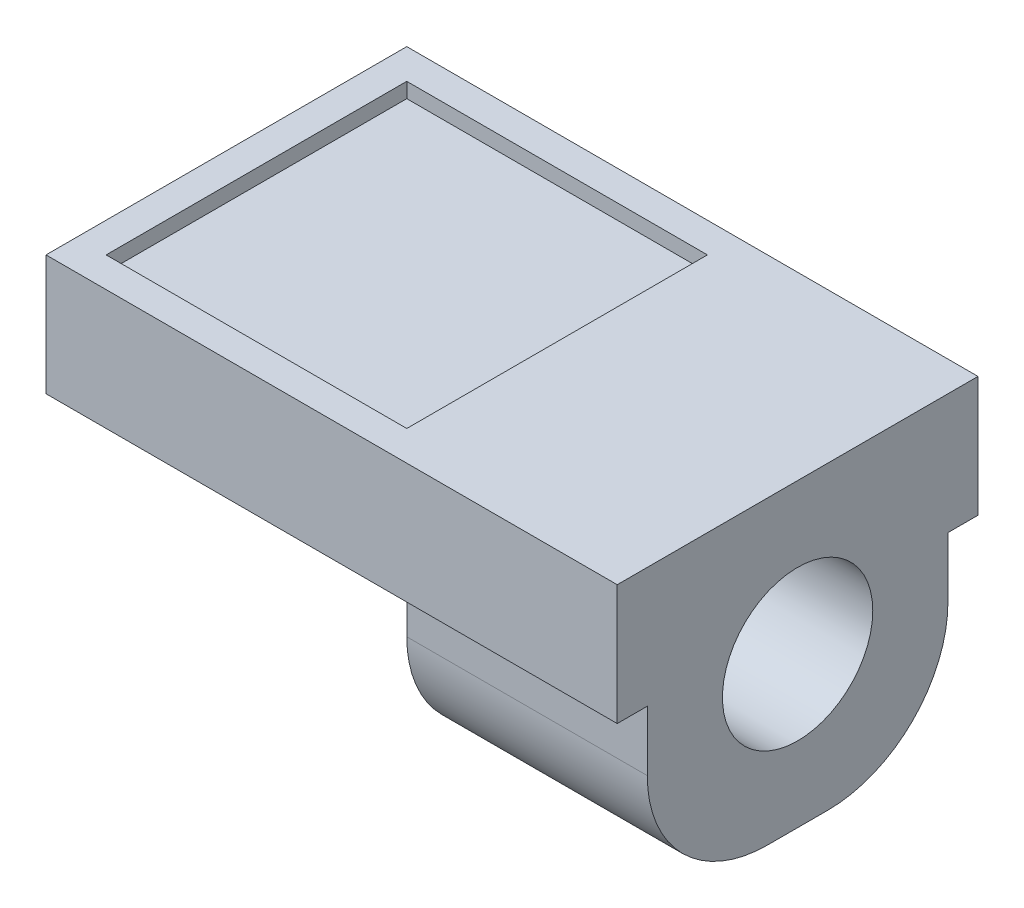
ISO-10303-21;
HEADER;
FILE_DESCRIPTION(('STEP AP214'),'2;1');
FILE_NAME('part.step','',(''),(''),'','','');
FILE_SCHEMA(('AUTOMOTIVE_DESIGN { 1 0 10303 214 1 1 1 1 }'));
ENDSEC;
DATA;
#1=APPLICATION_CONTEXT('core data for automotive mechanical design processes');
#2=APPLICATION_PROTOCOL_DEFINITION('international standard','automotive_design',2000,#1);
#3=PRODUCT_CONTEXT('',#1,'mechanical');
#4=PRODUCT('Part','Part','',(#3));
#5=PRODUCT_RELATED_PRODUCT_CATEGORY('part','',(#4));
#6=PRODUCT_DEFINITION_FORMATION('','',#4);
#7=PRODUCT_DEFINITION_CONTEXT('part definition',#1,'design');
#8=PRODUCT_DEFINITION('design','',#6,#7);
#9=PRODUCT_DEFINITION_SHAPE('','',#8);
#10=(LENGTH_UNIT() NAMED_UNIT(*) SI_UNIT(.MILLI.,.METRE.));
#11=(NAMED_UNIT(*) PLANE_ANGLE_UNIT() SI_UNIT($,.RADIAN.));
#12=(NAMED_UNIT(*) SI_UNIT($,.STERADIAN.) SOLID_ANGLE_UNIT());
#13=UNCERTAINTY_MEASURE_WITH_UNIT(LENGTH_MEASURE(1.E-05),#10,'distance_accuracy_value','');
#14=(GEOMETRIC_REPRESENTATION_CONTEXT(3) GLOBAL_UNCERTAINTY_ASSIGNED_CONTEXT((#13)) GLOBAL_UNIT_ASSIGNED_CONTEXT((#10,
#11,#12)) REPRESENTATION_CONTEXT('',''));
#15=CARTESIAN_POINT('',(0.,0.,0.));
#16=DIRECTION('',(0.,0.,1.));
#17=DIRECTION('',(1.,0.,0.));
#18=AXIS2_PLACEMENT_3D('',#15,#16,#17);
#19=CARTESIAN_POINT('',(0.,0.,0.));
#20=DIRECTION('',(0.,-1.,0.));
#21=DIRECTION('',(0.,0.,-1.));
#22=AXIS2_PLACEMENT_3D('',#19,#20,#21);
#23=PLANE('',#22);
#24=DIRECTION('',(0.,0.,-1.));
#25=VECTOR('',#24,1.);
#26=CARTESIAN_POINT('',(4.,0.,5.));
#27=LINE('',#26,#25);
#28=CARTESIAN_POINT('',(4.,0.,1.));
#29=VERTEX_POINT('',#28);
#30=CARTESIAN_POINT('',(4.,0.,-1.));
#31=VERTEX_POINT('',#30);
#32=EDGE_CURVE('E310',#29,#31,#27,.T.);
#33=ORIENTED_EDGE('',*,*,#32,.F.);
#34=DIRECTION('',(1.,0.,0.));
#35=VECTOR('',#34,1.);
#36=CARTESIAN_POINT('',(-4.,0.,1.));
#37=LINE('',#36,#35);
#38=CARTESIAN_POINT('',(0.,0.,1.));
#39=VERTEX_POINT('',#38);
#40=EDGE_CURVE('E271',#29,#39,#37,.F.);
#41=ORIENTED_EDGE('',*,*,#40,.T.);
#42=CARTESIAN_POINT('',(0.,0.,0.));
#43=DIRECTION('',(0.,-1.,0.));
#44=DIRECTION('',(0.,0.,-1.));
#45=AXIS2_PLACEMENT_3D('',#42,#43,#44);
#46=CIRCLE('',#45,1.);
#47=CARTESIAN_POINT('',(0.,0.,-1.));
#48=VERTEX_POINT('',#47);
#49=EDGE_CURVE('E205',#48,#39,#46,.T.);
#50=ORIENTED_EDGE('',*,*,#49,.F.);
#51=DIRECTION('',(-1.,0.,0.));
#52=VECTOR('',#51,1.);
#53=CARTESIAN_POINT('',(4.,0.,-1.));
#54=LINE('',#53,#52);
#55=EDGE_CURVE('E275',#48,#31,#54,.F.);
#56=ORIENTED_EDGE('',*,*,#55,.T.);
#57=EDGE_LOOP('',(#33,#41,#50,#56));
#58=FACE_BOUND('',#57,.T.);
#59=ADVANCED_FACE('F33',(#58),#23,.T.);
#60=CARTESIAN_POINT('',(0.,8.,0.));
#61=DIRECTION('',(0.,1.,0.));
#62=DIRECTION('',(0.,0.,1.));
#63=AXIS2_PLACEMENT_3D('',#60,#61,#62);
#64=PLANE('',#63);
#65=DIRECTION('',(0.,0.,1.));
#66=VECTOR('',#65,1.);
#67=CARTESIAN_POINT('',(-14.,8.,-5.));
#68=LINE('',#67,#66);
#69=CARTESIAN_POINT('',(-14.,8.,-5.));
#70=VERTEX_POINT('',#69);
#71=CARTESIAN_POINT('',(-14.,8.,5.));
#72=VERTEX_POINT('',#71);
#73=EDGE_CURVE('E376',#70,#72,#68,.T.);
#74=ORIENTED_EDGE('',*,*,#73,.F.);
#75=DIRECTION('',(-1.,0.,0.));
#76=VECTOR('',#75,1.);
#77=CARTESIAN_POINT('',(4.,8.,-5.));
#78=LINE('',#77,#76);
#79=CARTESIAN_POINT('',(-4.,8.,-5.));
#80=VERTEX_POINT('',#79);
#81=EDGE_CURVE('E334',#80,#70,#78,.T.);
#82=ORIENTED_EDGE('',*,*,#81,.F.);
#83=DIRECTION('',(0.,0.,1.));
#84=VECTOR('',#83,1.);
#85=CARTESIAN_POINT('',(-4.,8.,5.));
#86=LINE('',#85,#84);
#87=CARTESIAN_POINT('',(-4.,8.,5.));
#88=VERTEX_POINT('',#87);
#89=EDGE_CURVE('E327',#80,#88,#86,.T.);
#90=ORIENTED_EDGE('',*,*,#89,.T.);
#91=DIRECTION('',(1.,0.,0.));
#92=VECTOR('',#91,1.);
#93=CARTESIAN_POINT('',(4.,8.,5.));
#94=LINE('',#93,#92);
#95=EDGE_CURVE('E331',#72,#88,#94,.T.);
#96=ORIENTED_EDGE('',*,*,#95,.F.);
#97=EDGE_LOOP('',(#74,#82,#90,#96));
#98=FACE_BOUND('',#97,.T.);
#99=ADVANCED_FACE('F228',(#98),#64,.F.);
#100=CARTESIAN_POINT('',(0.,0.,5.));
#101=DIRECTION('',(0.,0.,-1.));
#102=DIRECTION('',(-1.,0.,0.));
#103=AXIS2_PLACEMENT_3D('',#100,#101,#102);
#104=PLANE('',#103);
#105=DIRECTION('',(1.,0.,0.));
#106=VECTOR('',#105,1.);
#107=CARTESIAN_POINT('',(4.,6.,5.));
#108=LINE('',#107,#106);
#109=CARTESIAN_POINT('',(-14.,6.,5.));
#110=VERTEX_POINT('',#109);
#111=CARTESIAN_POINT('',(-4.,6.,5.));
#112=VERTEX_POINT('',#111);
#113=EDGE_CURVE('E345',#110,#112,#108,.T.);
#114=ORIENTED_EDGE('',*,*,#113,.F.);
#115=DIRECTION('',(0.,1.,0.));
#116=VECTOR('',#115,1.);
#117=CARTESIAN_POINT('',(-14.,6.,5.));
#118=LINE('',#117,#116);
#119=EDGE_CURVE('E373',#110,#72,#118,.T.);
#120=ORIENTED_EDGE('',*,*,#119,.T.);
#121=ORIENTED_EDGE('',*,*,#95,.T.);
#122=DIRECTION('',(0.,-1.,0.));
#123=VECTOR('',#122,1.);
#124=CARTESIAN_POINT('',(-4.,8.,5.));
#125=LINE('',#124,#123);
#126=EDGE_CURVE('E294',#88,#112,#125,.T.);
#127=ORIENTED_EDGE('',*,*,#126,.T.);
#128=EDGE_LOOP('',(#114,#120,#121,#127));
#129=FACE_BOUND('',#128,.T.);
#130=ADVANCED_FACE('F235',(#129),#104,.T.);
#131=CARTESIAN_POINT('',(0.,0.,-5.));
#132=DIRECTION('',(0.,0.,1.));
#133=DIRECTION('',(-1.,0.,0.));
#134=AXIS2_PLACEMENT_3D('',#131,#132,#133);
#135=PLANE('',#134);
#136=ORIENTED_EDGE('',*,*,#81,.T.);
#137=DIRECTION('',(0.,1.,0.));
#138=VECTOR('',#137,1.);
#139=CARTESIAN_POINT('',(-14.,6.,-5.));
#140=LINE('',#139,#138);
#141=CARTESIAN_POINT('',(-14.,6.,-5.));
#142=VERTEX_POINT('',#141);
#143=EDGE_CURVE('E360',#142,#70,#140,.T.);
#144=ORIENTED_EDGE('',*,*,#143,.F.);
#145=DIRECTION('',(1.,0.,0.));
#146=VECTOR('',#145,1.);
#147=CARTESIAN_POINT('',(4.,6.,-5.));
#148=LINE('',#147,#146);
#149=CARTESIAN_POINT('',(-4.,6.,-5.));
#150=VERTEX_POINT('',#149);
#151=EDGE_CURVE('E304',#142,#150,#148,.T.);
#152=ORIENTED_EDGE('',*,*,#151,.T.);
#153=DIRECTION('',(0.,-1.,0.));
#154=VECTOR('',#153,1.);
#155=CARTESIAN_POINT('',(-4.,8.,-5.));
#156=LINE('',#155,#154);
#157=EDGE_CURVE('E324',#80,#150,#156,.T.);
#158=ORIENTED_EDGE('',*,*,#157,.F.);
#159=EDGE_LOOP('',(#136,#144,#152,#158));
#160=FACE_BOUND('',#159,.T.);
#161=ADVANCED_FACE('F404',(#160),#135,.T.);
#162=CARTESIAN_POINT('',(-4.,8.,5.));
#163=DIRECTION('',(0.,0.,-1.));
#164=DIRECTION('',(-1.,0.,0.));
#165=AXIS2_PLACEMENT_3D('',#162,#163,#164);
#166=PLANE('',#165);
#167=CARTESIAN_POINT('',(-4.,4.,5.));
#168=VERTEX_POINT('',#167);
#169=EDGE_CURVE('E283',#112,#168,#125,.T.);
#170=ORIENTED_EDGE('',*,*,#169,.T.);
#171=DIRECTION('',(1.,0.,0.));
#172=VECTOR('',#171,1.);
#173=CARTESIAN_POINT('',(4.,4.,5.));
#174=LINE('',#173,#172);
#175=CARTESIAN_POINT('',(4.,4.,5.));
#176=VERTEX_POINT('',#175);
#177=EDGE_CURVE('E290',#168,#176,#174,.T.);
#178=ORIENTED_EDGE('',*,*,#177,.T.);
#179=DIRECTION('',(0.,-1.,0.));
#180=VECTOR('',#179,1.);
#181=CARTESIAN_POINT('',(4.,8.,5.));
#182=LINE('',#181,#180);
#183=CARTESIAN_POINT('',(4.,6.,5.));
#184=VERTEX_POINT('',#183);
#185=EDGE_CURVE('E295',#184,#176,#182,.T.);
#186=ORIENTED_EDGE('',*,*,#185,.F.);
#187=EDGE_CURVE('E293',#112,#184,#108,.T.);
#188=ORIENTED_EDGE('',*,*,#187,.F.);
#189=EDGE_LOOP('',(#170,#178,#186,#188));
#190=FACE_BOUND('',#189,.T.);
#191=ADVANCED_FACE('F289',(#190),#166,.F.);
#192=CARTESIAN_POINT('',(4.,8.,5.));
#193=DIRECTION('',(-1.,0.,0.));
#194=DIRECTION('',(0.,0.,1.));
#195=AXIS2_PLACEMENT_3D('',#192,#193,#194);
#196=PLANE('',#195);
#197=CARTESIAN_POINT('',(4.,5.,0.));
#198=DIRECTION('',(1.,0.,0.));
#199=DIRECTION('',(0.,0.,-1.));
#200=AXIS2_PLACEMENT_3D('',#197,#198,#199);
#201=CIRCLE('',#200,2.5);
#202=CARTESIAN_POINT('',(4.,5.,-2.5));
#203=VERTEX_POINT('',#202);
#204=EDGE_CURVE('E266',#203,#203,#201,.T.);
#205=ORIENTED_EDGE('',*,*,#204,.F.);
#206=EDGE_LOOP('',(#205));
#207=FACE_BOUND('',#206,.T.);
#208=ORIENTED_EDGE('',*,*,#185,.T.);
#209=CARTESIAN_POINT('',(4.,4.,1.));
#210=DIRECTION('',(-1.,0.,0.));
#211=DIRECTION('',(0.,0.,1.));
#212=AXIS2_PLACEMENT_3D('',#209,#210,#211);
#213=CIRCLE('',#212,4.);
#214=EDGE_CURVE('E297',#176,#29,#213,.F.);
#215=ORIENTED_EDGE('',*,*,#214,.T.);
#216=ORIENTED_EDGE('',*,*,#32,.T.);
#217=CARTESIAN_POINT('',(4.,4.,-1.));
#218=DIRECTION('',(-1.,0.,0.));
#219=DIRECTION('',(0.,0.,1.));
#220=AXIS2_PLACEMENT_3D('',#217,#218,#219);
#221=CIRCLE('',#220,4.);
#222=CARTESIAN_POINT('',(4.,4.,-5.));
#223=VERTEX_POINT('',#222);
#224=EDGE_CURVE('E298',#31,#223,#221,.F.);
#225=ORIENTED_EDGE('',*,*,#224,.T.);
#226=DIRECTION('',(0.,-1.,0.));
#227=VECTOR('',#226,1.);
#228=CARTESIAN_POINT('',(4.,8.,-5.));
#229=LINE('',#228,#227);
#230=CARTESIAN_POINT('',(4.,6.,-5.));
#231=VERTEX_POINT('',#230);
#232=EDGE_CURVE('E306',#231,#223,#229,.T.);
#233=ORIENTED_EDGE('',*,*,#232,.F.);
#234=DIRECTION('',(0.,0.,1.));
#235=VECTOR('',#234,1.);
#236=CARTESIAN_POINT('',(4.,6.,-6.));
#237=LINE('',#236,#235);
#238=CARTESIAN_POINT('',(4.,6.,-6.));
#239=VERTEX_POINT('',#238);
#240=EDGE_CURVE('E348',#239,#231,#237,.T.);
#241=ORIENTED_EDGE('',*,*,#240,.F.);
#242=DIRECTION('',(0.,1.,0.));
#243=VECTOR('',#242,1.);
#244=CARTESIAN_POINT('',(4.,10.,-6.));
#245=LINE('',#244,#243);
#246=CARTESIAN_POINT('',(4.,10.,-6.));
#247=VERTEX_POINT('',#246);
#248=EDGE_CURVE('E359',#239,#247,#245,.T.);
#249=ORIENTED_EDGE('',*,*,#248,.T.);
#250=DIRECTION('',(0.,0.,-1.));
#251=VECTOR('',#250,1.);
#252=CARTESIAN_POINT('',(4.,10.,5.));
#253=LINE('',#252,#251);
#254=CARTESIAN_POINT('',(4.,10.,6.));
#255=VERTEX_POINT('',#254);
#256=EDGE_CURVE('E333',#255,#247,#253,.T.);
#257=ORIENTED_EDGE('',*,*,#256,.F.);
#258=DIRECTION('',(0.,1.,0.));
#259=VECTOR('',#258,1.);
#260=CARTESIAN_POINT('',(4.,10.,6.));
#261=LINE('',#260,#259);
#262=CARTESIAN_POINT('',(4.,6.,6.));
#263=VERTEX_POINT('',#262);
#264=EDGE_CURVE('E347',#263,#255,#261,.T.);
#265=ORIENTED_EDGE('',*,*,#264,.F.);
#266=DIRECTION('',(0.,0.,-1.));
#267=VECTOR('',#266,1.);
#268=CARTESIAN_POINT('',(4.,6.,6.));
#269=LINE('',#268,#267);
#270=EDGE_CURVE('E341',#263,#184,#269,.T.);
#271=ORIENTED_EDGE('',*,*,#270,.T.);
#272=EDGE_LOOP('',(#208,#215,#216,#225,#233,#241,#249,#257,#265,#271));
#273=FACE_BOUND('',#272,.T.);
#274=ADVANCED_FACE('F313',(#207,#273),#196,.F.);
#275=CARTESIAN_POINT('',(-4.,8.,-5.));
#276=DIRECTION('',(0.,0.,1.));
#277=DIRECTION('',(1.,0.,0.));
#278=AXIS2_PLACEMENT_3D('',#275,#276,#277);
#279=PLANE('',#278);
#280=ORIENTED_EDGE('',*,*,#232,.T.);
#281=DIRECTION('',(-1.,0.,0.));
#282=VECTOR('',#281,1.);
#283=CARTESIAN_POINT('',(-4.,4.,-5.));
#284=LINE('',#283,#282);
#285=CARTESIAN_POINT('',(-4.,4.,-5.));
#286=VERTEX_POINT('',#285);
#287=EDGE_CURVE('E11',#223,#286,#284,.T.);
#288=ORIENTED_EDGE('',*,*,#287,.T.);
#289=EDGE_CURVE('E321',#150,#286,#156,.T.);
#290=ORIENTED_EDGE('',*,*,#289,.F.);
#291=EDGE_CURVE('E299',#150,#231,#148,.T.);
#292=ORIENTED_EDGE('',*,*,#291,.T.);
#293=EDGE_LOOP('',(#280,#288,#290,#292));
#294=FACE_BOUND('',#293,.T.);
#295=ADVANCED_FACE('F251',(#294),#279,.F.);
#296=CARTESIAN_POINT('',(-4.,8.,5.));
#297=DIRECTION('',(1.,0.,0.));
#298=DIRECTION('',(0.,0.,-1.));
#299=AXIS2_PLACEMENT_3D('',#296,#297,#298);
#300=PLANE('',#299);
#301=CARTESIAN_POINT('',(-4.,5.,0.));
#302=DIRECTION('',(1.,0.,0.));
#303=DIRECTION('',(0.,0.,-1.));
#304=AXIS2_PLACEMENT_3D('',#301,#302,#303);
#305=CIRCLE('',#304,2.5);
#306=CARTESIAN_POINT('',(-4.,5.,-2.5));
#307=VERTEX_POINT('',#306);
#308=EDGE_CURVE('E379',#307,#307,#305,.F.);
#309=ORIENTED_EDGE('',*,*,#308,.F.);
#310=EDGE_LOOP('',(#309));
#311=FACE_BOUND('',#310,.T.);
#312=DIRECTION('',(0.,0.,1.));
#313=VECTOR('',#312,1.);
#314=CARTESIAN_POINT('',(-4.,0.,5.));
#315=LINE('',#314,#313);
#316=CARTESIAN_POINT('',(-4.,0.,-1.));
#317=VERTEX_POINT('',#316);
#318=CARTESIAN_POINT('',(-4.,0.,1.));
#319=VERTEX_POINT('',#318);
#320=EDGE_CURVE('E285',#317,#319,#315,.T.);
#321=ORIENTED_EDGE('',*,*,#320,.T.);
#322=CARTESIAN_POINT('',(-4.,4.,1.));
#323=DIRECTION('',(1.,0.,0.));
#324=DIRECTION('',(0.,0.,-1.));
#325=AXIS2_PLACEMENT_3D('',#322,#323,#324);
#326=CIRCLE('',#325,4.);
#327=EDGE_CURVE('E41',#319,#168,#326,.F.);
#328=ORIENTED_EDGE('',*,*,#327,.T.);
#329=ORIENTED_EDGE('',*,*,#169,.F.);
#330=ORIENTED_EDGE('',*,*,#126,.F.);
#331=ORIENTED_EDGE('',*,*,#89,.F.);
#332=ORIENTED_EDGE('',*,*,#157,.T.);
#333=ORIENTED_EDGE('',*,*,#289,.T.);
#334=CARTESIAN_POINT('',(-4.,4.,-1.));
#335=DIRECTION('',(1.,0.,0.));
#336=DIRECTION('',(0.,0.,-1.));
#337=AXIS2_PLACEMENT_3D('',#334,#335,#336);
#338=CIRCLE('',#337,4.);
#339=EDGE_CURVE('E56',#286,#317,#338,.F.);
#340=ORIENTED_EDGE('',*,*,#339,.T.);
#341=EDGE_LOOP('',(#321,#328,#329,#330,#331,#332,#333,#340));
#342=FACE_BOUND('',#341,.T.);
#343=ADVANCED_FACE('F243',(#311,#342),#300,.F.);
#344=EDGE_CURVE('E204',#39,#48,#46,.T.);
#345=ORIENTED_EDGE('',*,*,#344,.F.);
#346=DIRECTION('',(1.,0.,0.));
#347=VECTOR('',#346,1.);
#348=CARTESIAN_POINT('',(-4.,0.,1.));
#349=LINE('',#348,#347);
#350=EDGE_CURVE('E259',#39,#319,#349,.F.);
#351=ORIENTED_EDGE('',*,*,#350,.T.);
#352=ORIENTED_EDGE('',*,*,#320,.F.);
#353=DIRECTION('',(-1.,0.,0.));
#354=VECTOR('',#353,1.);
#355=CARTESIAN_POINT('',(4.,0.,-1.));
#356=LINE('',#355,#354);
#357=EDGE_CURVE('E261',#317,#48,#356,.F.);
#358=ORIENTED_EDGE('',*,*,#357,.T.);
#359=EDGE_LOOP('',(#345,#351,#352,#358));
#360=FACE_BOUND('',#359,.T.);
#361=ADVANCED_FACE('F231',(#360),#23,.T.);
#362=CARTESIAN_POINT('',(-15.,10.,5.));
#363=DIRECTION('',(1.,0.,0.));
#364=DIRECTION('',(0.,0.,-1.));
#365=AXIS2_PLACEMENT_3D('',#362,#363,#364);
#366=PLANE('',#365);
#367=DIRECTION('',(0.,-1.,0.));
#368=VECTOR('',#367,1.);
#369=CARTESIAN_POINT('',(-15.,10.,-6.));
#370=LINE('',#369,#368);
#371=CARTESIAN_POINT('',(-15.,10.,-6.));
#372=VERTEX_POINT('',#371);
#373=CARTESIAN_POINT('',(-15.,6.,-6.));
#374=VERTEX_POINT('',#373);
#375=EDGE_CURVE('E363',#372,#374,#370,.T.);
#376=ORIENTED_EDGE('',*,*,#375,.T.);
#377=DIRECTION('',(0.,0.,-1.));
#378=VECTOR('',#377,1.);
#379=CARTESIAN_POINT('',(-15.,6.,6.));
#380=LINE('',#379,#378);
#381=CARTESIAN_POINT('',(-15.,6.,6.));
#382=VERTEX_POINT('',#381);
#383=EDGE_CURVE('E337',#382,#374,#380,.T.);
#384=ORIENTED_EDGE('',*,*,#383,.F.);
#385=DIRECTION('',(0.,-1.,0.));
#386=VECTOR('',#385,1.);
#387=CARTESIAN_POINT('',(-15.,10.,6.));
#388=LINE('',#387,#386);
#389=CARTESIAN_POINT('',(-15.,10.,6.));
#390=VERTEX_POINT('',#389);
#391=EDGE_CURVE('E350',#390,#382,#388,.T.);
#392=ORIENTED_EDGE('',*,*,#391,.F.);
#393=DIRECTION('',(0.,0.,1.));
#394=VECTOR('',#393,1.);
#395=CARTESIAN_POINT('',(-15.,10.,5.));
#396=LINE('',#395,#394);
#397=EDGE_CURVE('E316',#372,#390,#396,.T.);
#398=ORIENTED_EDGE('',*,*,#397,.F.);
#399=EDGE_LOOP('',(#376,#384,#392,#398));
#400=FACE_BOUND('',#399,.T.);
#401=ADVANCED_FACE('F242',(#400),#366,.F.);
#402=CARTESIAN_POINT('',(0.,10.,0.));
#403=DIRECTION('',(0.,1.,0.));
#404=DIRECTION('',(0.,0.,1.));
#405=AXIS2_PLACEMENT_3D('',#402,#403,#404);
#406=PLANE('',#405);
#407=DIRECTION('',(1.,0.,0.));
#408=VECTOR('',#407,1.);
#409=CARTESIAN_POINT('',(-14.,10.,5.));
#410=LINE('',#409,#408);
#411=CARTESIAN_POINT('',(-14.,10.,5.));
#412=VERTEX_POINT('',#411);
#413=CARTESIAN_POINT('',(-4.,10.,5.));
#414=VERTEX_POINT('',#413);
#415=EDGE_CURVE('E48',#412,#414,#410,.T.);
#416=ORIENTED_EDGE('',*,*,#415,.F.);
#417=DIRECTION('',(0.,0.,1.));
#418=VECTOR('',#417,1.);
#419=CARTESIAN_POINT('',(-14.,10.,-5.));
#420=LINE('',#419,#418);
#421=CARTESIAN_POINT('',(-14.,10.,-5.));
#422=VERTEX_POINT('',#421);
#423=EDGE_CURVE('E178',#422,#412,#420,.T.);
#424=ORIENTED_EDGE('',*,*,#423,.F.);
#425=DIRECTION('',(1.,0.,0.));
#426=VECTOR('',#425,1.);
#427=CARTESIAN_POINT('',(-14.,10.,-5.));
#428=LINE('',#427,#426);
#429=CARTESIAN_POINT('',(-4.,10.,-5.));
#430=VERTEX_POINT('',#429);
#431=EDGE_CURVE('E181',#422,#430,#428,.T.);
#432=ORIENTED_EDGE('',*,*,#431,.T.);
#433=DIRECTION('',(0.,0.,1.));
#434=VECTOR('',#433,1.);
#435=CARTESIAN_POINT('',(-4.,10.,-5.));
#436=LINE('',#435,#434);
#437=EDGE_CURVE('E187',#430,#414,#436,.T.);
#438=ORIENTED_EDGE('',*,*,#437,.T.);
#439=EDGE_LOOP('',(#416,#424,#432,#438));
#440=FACE_BOUND('',#439,.T.);
#441=ORIENTED_EDGE('',*,*,#256,.T.);
#442=DIRECTION('',(-1.,0.,0.));
#443=VECTOR('',#442,1.);
#444=CARTESIAN_POINT('',(4.,10.,-6.));
#445=LINE('',#444,#443);
#446=EDGE_CURVE('E357',#247,#372,#445,.T.);
#447=ORIENTED_EDGE('',*,*,#446,.T.);
#448=ORIENTED_EDGE('',*,*,#397,.T.);
#449=DIRECTION('',(-1.,0.,0.));
#450=VECTOR('',#449,1.);
#451=CARTESIAN_POINT('',(4.,10.,6.));
#452=LINE('',#451,#450);
#453=EDGE_CURVE('E352',#255,#390,#452,.T.);
#454=ORIENTED_EDGE('',*,*,#453,.F.);
#455=EDGE_LOOP('',(#441,#447,#448,#454));
#456=FACE_BOUND('',#455,.T.);
#457=ADVANCED_FACE('F249',(#440,#456),#406,.T.);
#458=CARTESIAN_POINT('',(4.,6.,6.));
#459=DIRECTION('',(0.,1.,0.));
#460=DIRECTION('',(-1.,0.,0.));
#461=AXIS2_PLACEMENT_3D('',#458,#459,#460);
#462=PLANE('',#461);
#463=ORIENTED_EDGE('',*,*,#383,.T.);
#464=DIRECTION('',(1.,0.,0.));
#465=VECTOR('',#464,1.);
#466=CARTESIAN_POINT('',(4.,6.,-6.));
#467=LINE('',#466,#465);
#468=EDGE_CURVE('E366',#374,#239,#467,.T.);
#469=ORIENTED_EDGE('',*,*,#468,.T.);
#470=ORIENTED_EDGE('',*,*,#240,.T.);
#471=ORIENTED_EDGE('',*,*,#291,.F.);
#472=ORIENTED_EDGE('',*,*,#151,.F.);
#473=DIRECTION('',(0.,0.,1.));
#474=VECTOR('',#473,1.);
#475=CARTESIAN_POINT('',(-14.,6.,-5.));
#476=LINE('',#475,#474);
#477=EDGE_CURVE('E375',#142,#110,#476,.T.);
#478=ORIENTED_EDGE('',*,*,#477,.T.);
#479=ORIENTED_EDGE('',*,*,#113,.T.);
#480=ORIENTED_EDGE('',*,*,#187,.T.);
#481=ORIENTED_EDGE('',*,*,#270,.F.);
#482=DIRECTION('',(1.,0.,0.));
#483=VECTOR('',#482,1.);
#484=CARTESIAN_POINT('',(4.,6.,6.));
#485=LINE('',#484,#483);
#486=EDGE_CURVE('E344',#382,#263,#485,.T.);
#487=ORIENTED_EDGE('',*,*,#486,.F.);
#488=EDGE_LOOP('',(#463,#469,#470,#471,#472,#478,#479,#480,#481,#487));
#489=FACE_BOUND('',#488,.T.);
#490=ADVANCED_FACE('F410',(#489),#462,.F.);
#491=CARTESIAN_POINT('',(0.,0.,6.));
#492=DIRECTION('',(0.,0.,-1.));
#493=DIRECTION('',(-1.,0.,0.));
#494=AXIS2_PLACEMENT_3D('',#491,#492,#493);
#495=PLANE('',#494);
#496=ORIENTED_EDGE('',*,*,#264,.T.);
#497=ORIENTED_EDGE('',*,*,#453,.T.);
#498=ORIENTED_EDGE('',*,*,#391,.T.);
#499=ORIENTED_EDGE('',*,*,#486,.T.);
#500=EDGE_LOOP('',(#496,#497,#498,#499));
#501=FACE_BOUND('',#500,.T.);
#502=ADVANCED_FACE('F402',(#501),#495,.F.);
#503=CARTESIAN_POINT('',(0.,0.,-6.));
#504=DIRECTION('',(0.,0.,1.));
#505=DIRECTION('',(-1.,0.,0.));
#506=AXIS2_PLACEMENT_3D('',#503,#504,#505);
#507=PLANE('',#506);
#508=ORIENTED_EDGE('',*,*,#248,.F.);
#509=ORIENTED_EDGE('',*,*,#468,.F.);
#510=ORIENTED_EDGE('',*,*,#375,.F.);
#511=ORIENTED_EDGE('',*,*,#446,.F.);
#512=EDGE_LOOP('',(#508,#509,#510,#511));
#513=FACE_BOUND('',#512,.T.);
#514=ADVANCED_FACE('F394',(#513),#507,.F.);
#515=CARTESIAN_POINT('',(-14.,6.,-5.));
#516=DIRECTION('',(-1.,0.,0.));
#517=DIRECTION('',(0.,0.,1.));
#518=AXIS2_PLACEMENT_3D('',#515,#516,#517);
#519=PLANE('',#518);
#520=ORIENTED_EDGE('',*,*,#73,.T.);
#521=ORIENTED_EDGE('',*,*,#119,.F.);
#522=ORIENTED_EDGE('',*,*,#477,.F.);
#523=ORIENTED_EDGE('',*,*,#143,.T.);
#524=EDGE_LOOP('',(#520,#521,#522,#523));
#525=FACE_BOUND('',#524,.T.);
#526=ADVANCED_FACE('F388',(#525),#519,.F.);
#527=CARTESIAN_POINT('',(-15.001,5.,0.));
#528=DIRECTION('',(1.,0.,0.));
#529=DIRECTION('',(0.,0.,-1.));
#530=AXIS2_PLACEMENT_3D('',#527,#528,#529);
#531=CYLINDRICAL_SURFACE('',#530,2.5);
#532=CARTESIAN_POINT('',(0.,2.70871215252208,-1.));
#533=CARTESIAN_POINT('',(-0.0535697490499455,2.70870674171789,-0.999994127101894));
#534=CARTESIAN_POINT('',(-0.107215267352352,2.70680698757867,-0.995669909297176));
#535=CARTESIAN_POINT('',(-0.212967416438534,2.69944542906077,-0.978534515296365));
#536=CARTESIAN_POINT('',(-0.265069758540244,2.69397452306574,-0.965701652221065));
#537=CARTESIAN_POINT('',(-0.366026470985025,2.68019772104351,-0.932117516284352));
#538=CARTESIAN_POINT('',(-0.414892273680128,2.67190251821442,-0.911396076262713));
#539=CARTESIAN_POINT('',(-0.508442525429808,2.6534266745236,-0.862710134685805));
#540=CARTESIAN_POINT('',(-0.55312788457543,2.64324644548038,-0.83474721463375));
#541=CARTESIAN_POINT('',(-0.639630201120727,2.62149567474484,-0.77066098729371));
#542=CARTESIAN_POINT('',(-0.681178211464734,2.60988041020627,-0.734189678863664));
#543=CARTESIAN_POINT('',(-0.757764498657687,2.58693771510594,-0.654854552887022));
#544=CARTESIAN_POINT('',(-0.792800500644929,2.57561038631814,-0.61198851083784));
#545=CARTESIAN_POINT('',(-0.856703198491352,2.55398296046573,-0.51900315517819));
#546=CARTESIAN_POINT('',(-0.885272150735323,2.54374098158216,-0.468664482806141));
#547=CARTESIAN_POINT('',(-0.933421784194904,2.52598036184227,-0.36341266143756));
#548=CARTESIAN_POINT('',(-0.953006122890975,2.51846061307663,-0.308501384643981));
#549=CARTESIAN_POINT('',(-0.9816707432187,2.50730837495857,-0.198483213419446));
#550=CARTESIAN_POINT('',(-0.99121365704451,2.50350531612321,-0.143514492402303));
#551=CARTESIAN_POINT('',(-1.00101424283135,2.49959844658648,-0.0326331643188262));
#552=CARTESIAN_POINT('',(-1.00127537796742,2.49949325615343,0.0232790829127009));
#553=CARTESIAN_POINT('',(-0.992758615112507,2.50289018589107,0.131116247357655));
#554=CARTESIAN_POINT('',(-0.984487613626535,2.50619001614082,0.183088726437016));
#555=CARTESIAN_POINT('',(-0.960003561844622,2.51575354265605,0.284836554609169));
#556=CARTESIAN_POINT('',(-0.943789928799805,2.52201745639444,0.334611742195079));
#557=CARTESIAN_POINT('',(-0.903681758561848,2.5370158777115,0.431448969255828));
#558=CARTESIAN_POINT('',(-0.879675142592234,2.545786197666,0.478458811689816));
#559=CARTESIAN_POINT('',(-0.824767496540495,2.56492707410151,0.567904075370287));
#560=CARTESIAN_POINT('',(-0.793864103451188,2.57529817867463,0.610337921358054));
#561=CARTESIAN_POINT('',(-0.723675432026703,2.59739181410833,0.692384413996076));
#562=CARTESIAN_POINT('',(-0.683973053708084,2.6091583673988,0.731628922636821));
#563=CARTESIAN_POINT('',(-0.598504714089517,2.6321916951761,0.803053707692663));
#564=CARTESIAN_POINT('',(-0.552736775922917,2.64345830511826,0.835231671879828));
#565=CARTESIAN_POINT('',(-0.454790488795524,2.66451551279094,0.892452094371466));
#566=CARTESIAN_POINT('',(-0.402467584758091,2.67425542909309,0.917267325867452));
#567=CARTESIAN_POINT('',(-0.293892254768994,2.69056204766338,0.957588129983133));
#568=CARTESIAN_POINT('',(-0.237642407614577,2.6971308103833,0.973099749202199));
#569=CARTESIAN_POINT('',(-0.126482111281974,2.70585120163718,0.993477474415979));
#570=CARTESIAN_POINT('',(-0.0716997764399168,2.70824816775962,0.998936048404205));
#571=CARTESIAN_POINT('',(0.0380386038839743,2.70905251061451,1.00078066322451));
#572=CARTESIAN_POINT('',(0.0929945916389208,2.70746109718768,0.997169455296441));
#573=CARTESIAN_POINT('',(0.19822946747744,2.70071977821434,0.981516447394262));
#574=CARTESIAN_POINT('',(0.248596468699753,2.69577771101115,0.969966531011728));
#575=CARTESIAN_POINT('',(0.346644202393005,2.68314974486064,0.939402093455638));
#576=CARTESIAN_POINT('',(0.394324336553656,2.67546323755628,0.920385917151196));
#577=CARTESIAN_POINT('',(0.487801178897745,2.65783109070025,0.874567819740726));
#578=CARTESIAN_POINT('',(0.533443094347228,2.64780647680432,0.847481434132297));
#579=CARTESIAN_POINT('',(0.619741493720833,2.62674807421081,0.786582612220937));
#580=CARTESIAN_POINT('',(0.660395936397798,2.61571387551968,0.752767436740991));
#581=CARTESIAN_POINT('',(0.738686704299606,2.59289542014301,0.676422105840241));
#582=CARTESIAN_POINT('',(0.775878282645515,2.58111596357399,0.633432714722549));
#583=CARTESIAN_POINT('',(0.842588538305169,2.55890102716218,0.541541816684422));
#584=CARTESIAN_POINT('',(0.872106903298617,2.5484656020338,0.492640069233932));
#585=CARTESIAN_POINT('',(0.922523813230613,2.53008142049857,0.39013996700088));
#586=CARTESIAN_POINT('',(0.943424422082893,2.52213206879863,0.336542740497032));
#587=CARTESIAN_POINT('',(0.975774426203815,2.50963643265355,0.226196795459612));
#588=CARTESIAN_POINT('',(0.987228950720033,2.50508830146228,0.169449805147135));
#589=CARTESIAN_POINT('',(0.999752350812693,2.50010495894744,0.0584082551731516));
#590=CARTESIAN_POINT('',(1.00145006423132,2.49942076627563,0.00419524629652769));
#591=CARTESIAN_POINT('',(0.996072260357947,2.50156978810704,-0.103716917866622));
#592=CARTESIAN_POINT('',(0.98899807110719,2.50440247016544,-0.157416149697311));
#593=CARTESIAN_POINT('',(0.96672660582076,2.51314243317872,-0.261085450973206));
#594=CARTESIAN_POINT('',(0.951785526962222,2.51895259682835,-0.311119402324193));
#595=CARTESIAN_POINT('',(0.914473597719088,2.53302526083981,-0.407961177379471));
#596=CARTESIAN_POINT('',(0.892101376989827,2.54128821347994,-0.454768404133638));
#597=CARTESIAN_POINT('',(0.839448400755329,2.55990952819971,-0.546101520928058));
#598=CARTESIAN_POINT('',(0.808861852557459,2.57034435135885,-0.590435193403212));
#599=CARTESIAN_POINT('',(0.741105740410533,2.59205298406776,-0.673527014262036));
#600=CARTESIAN_POINT('',(0.703933451769942,2.6033271397475,-0.712282842872878));
#601=CARTESIAN_POINT('',(0.621342387737475,2.62631118220289,-0.785600632542996));
#602=CARTESIAN_POINT('',(0.575555563299447,2.63800483697308,-0.819754443599514));
#603=CARTESIAN_POINT('',(0.478528931285615,2.6597516426241,-0.879923725219699));
#604=CARTESIAN_POINT('',(0.427288483545072,2.66980460056272,-0.905938238949994));
#605=CARTESIAN_POINT('',(0.325481399075964,2.68620567771046,-0.946995543836655));
#606=CARTESIAN_POINT('',(0.275267382624413,2.69280540694176,-0.962813757082103));
#607=CARTESIAN_POINT('',(0.172757290184829,2.70276998198018,-0.986358878909192));
#608=CARTESIAN_POINT('',(0.120467442016519,2.70614383963912,-0.994108333944007));
#609=CARTESIAN_POINT('',(0.0453112188310361,2.70837770621182,-0.999232129155086));
#610=CARTESIAN_POINT('',(0.022662389501199,2.70871444153321,-1.00000248449744));
#611=CARTESIAN_POINT('',(0.,2.70871215252208,-1.));
#612=B_SPLINE_CURVE_WITH_KNOTS('',3,(#532,#533,#534,#535,#536,#537,#538,#539,#540,#541,#542,
#543,#544,#545,#546,#547,#548,#549,#550,#551,#552,#553,#554,#555,#556,#557,#558,#559,#560,#561,
#562,#563,#564,#565,#566,#567,#568,#569,#570,#571,#572,#573,#574,#575,#576,#577,#578,#579,#580,
#581,#582,#583,#584,#585,#586,#587,#588,#589,#590,#591,#592,#593,#594,#595,#596,#597,#598,#599,
#600,#601,#602,#603,#604,#605,#606,#607,#608,#609,#610,#611),.UNSPECIFIED.,.T.,.F.,(4,2,2,2,2,2,
2,2,2,2,2,2,2,2,2,2,2,2,2,2,2,2,2,2,2,2,2,2,2,2,2,2,2,2,2,2,2,2,2,4),(0.,0.160638824383827,
0.321688667911123,0.482135411646695,0.642547144119307,0.811278091422123,0.980067871741711,
1.15551334545714,1.3308873348474,1.49777091443592,1.66459222652836,1.82204322415151,
1.9795057756453,2.13934150117449,2.29923207470016,2.46962022040678,2.64006403563563,
2.81532229357288,2.99046652397056,3.15491073759215,3.31930507450975,3.47433624039577,
3.62940179322824,3.79075577323355,3.9521755725993,4.12551867120495,4.29886882423379,
4.47217743653411,4.64539187974073,4.80730519874981,4.96919400753306,5.12610997218681,
5.28305488911298,5.44693525566967,5.61088358279108,5.78498126639812,5.95909940876599,
6.11758330406543,6.27562315106627,6.34358052760367),.UNSPECIFIED.);
#613=CARTESIAN_POINT('',(0.,2.70871215252208,-1.));
#614=VERTEX_POINT('',#613);
#615=EDGE_CURVE('E193',#614,#614,#612,.T.);
#616=ORIENTED_EDGE('',*,*,#615,.F.);
#617=EDGE_LOOP('',(#616));
#618=FACE_BOUND('',#617,.T.);
#619=ORIENTED_EDGE('',*,*,#204,.T.);
#620=EDGE_LOOP('',(#619));
#621=FACE_BOUND('',#620,.T.);
#622=ORIENTED_EDGE('',*,*,#308,.T.);
#623=EDGE_LOOP('',(#622));
#624=FACE_BOUND('',#623,.T.);
#625=ADVANCED_FACE('F386',(#618,#621,#624),#531,.F.);
#626=CARTESIAN_POINT('',(0.,10.001,0.));
#627=DIRECTION('',(0.,-1.,0.));
#628=DIRECTION('',(0.,0.,-1.));
#629=AXIS2_PLACEMENT_3D('',#626,#627,#628);
#630=CYLINDRICAL_SURFACE('',#629,1.);
#631=ORIENTED_EDGE('',*,*,#49,.T.);
#632=ORIENTED_EDGE('',*,*,#344,.T.);
#633=EDGE_LOOP('',(#631,#632));
#634=FACE_BOUND('',#633,.T.);
#635=ORIENTED_EDGE('',*,*,#615,.T.);
#636=EDGE_LOOP('',(#635));
#637=FACE_BOUND('',#636,.T.);
#638=ADVANCED_FACE('F207',(#634,#637),#630,.F.);
#639=CARTESIAN_POINT('',(-4.,4.,1.));
#640=DIRECTION('',(-1.,0.,0.));
#641=DIRECTION('',(0.,0.,1.));
#642=AXIS2_PLACEMENT_3D('',#639,#640,#641);
#643=CYLINDRICAL_SURFACE('',#642,4.);
#644=ORIENTED_EDGE('',*,*,#350,.F.);
#645=ORIENTED_EDGE('',*,*,#40,.F.);
#646=ORIENTED_EDGE('',*,*,#214,.F.);
#647=ORIENTED_EDGE('',*,*,#177,.F.);
#648=ORIENTED_EDGE('',*,*,#327,.F.);
#649=EDGE_LOOP('',(#644,#645,#646,#647,#648));
#650=FACE_BOUND('',#649,.T.);
#651=ADVANCED_FACE('F270',(#650),#643,.T.);
#652=CARTESIAN_POINT('',(-4.,4.,-1.));
#653=DIRECTION('',(1.,0.,0.));
#654=DIRECTION('',(0.,0.,-1.));
#655=AXIS2_PLACEMENT_3D('',#652,#653,#654);
#656=CYLINDRICAL_SURFACE('',#655,4.);
#657=ORIENTED_EDGE('',*,*,#55,.F.);
#658=ORIENTED_EDGE('',*,*,#357,.F.);
#659=ORIENTED_EDGE('',*,*,#339,.F.);
#660=ORIENTED_EDGE('',*,*,#287,.F.);
#661=ORIENTED_EDGE('',*,*,#224,.F.);
#662=EDGE_LOOP('',(#657,#658,#659,#660,#661));
#663=FACE_BOUND('',#662,.T.);
#664=ADVANCED_FACE('F35',(#663),#656,.T.);
#665=CARTESIAN_POINT('',(-14.,9.5,5.));
#666=DIRECTION('',(0.,0.,1.));
#667=DIRECTION('',(1.,0.,0.));
#668=AXIS2_PLACEMENT_3D('',#665,#666,#667);
#669=PLANE('',#668);
#670=ORIENTED_EDGE('',*,*,#415,.T.);
#671=DIRECTION('',(0.,1.,0.));
#672=VECTOR('',#671,1.);
#673=CARTESIAN_POINT('',(-4.,9.5,5.));
#674=LINE('',#673,#672);
#675=CARTESIAN_POINT('',(-4.,9.5,5.));
#676=VERTEX_POINT('',#675);
#677=EDGE_CURVE('E162',#676,#414,#674,.T.);
#678=ORIENTED_EDGE('',*,*,#677,.F.);
#679=DIRECTION('',(1.,0.,0.));
#680=VECTOR('',#679,1.);
#681=CARTESIAN_POINT('',(-14.,9.5,5.));
#682=LINE('',#681,#680);
#683=CARTESIAN_POINT('',(-14.,9.5,5.));
#684=VERTEX_POINT('',#683);
#685=EDGE_CURVE('E169',#684,#676,#682,.T.);
#686=ORIENTED_EDGE('',*,*,#685,.F.);
#687=DIRECTION('',(0.,1.,0.));
#688=VECTOR('',#687,1.);
#689=CARTESIAN_POINT('',(-14.,9.5,5.));
#690=LINE('',#689,#688);
#691=EDGE_CURVE('E191',#684,#412,#690,.T.);
#692=ORIENTED_EDGE('',*,*,#691,.T.);
#693=EDGE_LOOP('',(#670,#678,#686,#692));
#694=FACE_BOUND('',#693,.T.);
#695=ADVANCED_FACE('F172',(#694),#669,.F.);
#696=CARTESIAN_POINT('',(-14.,9.5,-5.));
#697=DIRECTION('',(-1.,0.,0.));
#698=DIRECTION('',(0.,0.,1.));
#699=AXIS2_PLACEMENT_3D('',#696,#697,#698);
#700=PLANE('',#699);
#701=ORIENTED_EDGE('',*,*,#423,.T.);
#702=ORIENTED_EDGE('',*,*,#691,.F.);
#703=DIRECTION('',(0.,0.,1.));
#704=VECTOR('',#703,1.);
#705=CARTESIAN_POINT('',(-14.,9.5,-5.));
#706=LINE('',#705,#704);
#707=CARTESIAN_POINT('',(-14.,9.5,-5.));
#708=VERTEX_POINT('',#707);
#709=EDGE_CURVE('E174',#708,#684,#706,.T.);
#710=ORIENTED_EDGE('',*,*,#709,.F.);
#711=DIRECTION('',(0.,1.,0.));
#712=VECTOR('',#711,1.);
#713=CARTESIAN_POINT('',(-14.,9.5,-5.));
#714=LINE('',#713,#712);
#715=EDGE_CURVE('E194',#708,#422,#714,.T.);
#716=ORIENTED_EDGE('',*,*,#715,.T.);
#717=EDGE_LOOP('',(#701,#702,#710,#716));
#718=FACE_BOUND('',#717,.T.);
#719=ADVANCED_FACE('F214',(#718),#700,.F.);
#720=CARTESIAN_POINT('',(-14.,9.5,-5.));
#721=DIRECTION('',(0.,0.,1.));
#722=DIRECTION('',(1.,0.,0.));
#723=AXIS2_PLACEMENT_3D('',#720,#721,#722);
#724=PLANE('',#723);
#725=ORIENTED_EDGE('',*,*,#431,.F.);
#726=ORIENTED_EDGE('',*,*,#715,.F.);
#727=DIRECTION('',(1.,0.,0.));
#728=VECTOR('',#727,1.);
#729=CARTESIAN_POINT('',(-14.,9.5,-5.));
#730=LINE('',#729,#728);
#731=CARTESIAN_POINT('',(-4.,9.5,-5.));
#732=VERTEX_POINT('',#731);
#733=EDGE_CURVE('E168',#708,#732,#730,.T.);
#734=ORIENTED_EDGE('',*,*,#733,.T.);
#735=DIRECTION('',(0.,1.,0.));
#736=VECTOR('',#735,1.);
#737=CARTESIAN_POINT('',(-4.,9.5,-5.));
#738=LINE('',#737,#736);
#739=EDGE_CURVE('E164',#732,#430,#738,.T.);
#740=ORIENTED_EDGE('',*,*,#739,.T.);
#741=EDGE_LOOP('',(#725,#726,#734,#740));
#742=FACE_BOUND('',#741,.T.);
#743=ADVANCED_FACE('F217',(#742),#724,.T.);
#744=CARTESIAN_POINT('',(-4.,9.5,-5.));
#745=DIRECTION('',(-1.,0.,0.));
#746=DIRECTION('',(0.,0.,1.));
#747=AXIS2_PLACEMENT_3D('',#744,#745,#746);
#748=PLANE('',#747);
#749=ORIENTED_EDGE('',*,*,#437,.F.);
#750=ORIENTED_EDGE('',*,*,#739,.F.);
#751=DIRECTION('',(0.,0.,1.));
#752=VECTOR('',#751,1.);
#753=CARTESIAN_POINT('',(-4.,9.5,-5.));
#754=LINE('',#753,#752);
#755=EDGE_CURVE('E159',#732,#676,#754,.T.);
#756=ORIENTED_EDGE('',*,*,#755,.T.);
#757=ORIENTED_EDGE('',*,*,#677,.T.);
#758=EDGE_LOOP('',(#749,#750,#756,#757));
#759=FACE_BOUND('',#758,.T.);
#760=ADVANCED_FACE('F161',(#759),#748,.T.);
#761=CARTESIAN_POINT('',(0.,9.5,0.));
#762=DIRECTION('',(0.,-1.,0.));
#763=DIRECTION('',(0.,0.,-1.));
#764=AXIS2_PLACEMENT_3D('',#761,#762,#763);
#765=PLANE('',#764);
#766=ORIENTED_EDGE('',*,*,#685,.T.);
#767=ORIENTED_EDGE('',*,*,#755,.F.);
#768=ORIENTED_EDGE('',*,*,#733,.F.);
#769=ORIENTED_EDGE('',*,*,#709,.T.);
#770=EDGE_LOOP('',(#766,#767,#768,#769));
#771=FACE_BOUND('',#770,.T.);
#772=ADVANCED_FACE('F176',(#771),#765,.F.);
#773=CLOSED_SHELL('',(#59,#99,#130,#161,#191,#274,#295,#343,#361,#401,#457,#490,#502,#514,#526,
#625,#638,#651,#664,#695,#719,#743,#760,#772));
#774=MANIFOLD_SOLID_BREP('B2',#773);
#775=ADVANCED_BREP_SHAPE_REPRESENTATION('',(#18,#774),#14);
#776=SHAPE_DEFINITION_REPRESENTATION(#9,#775);
ENDSEC;
END-ISO-10303-21;
